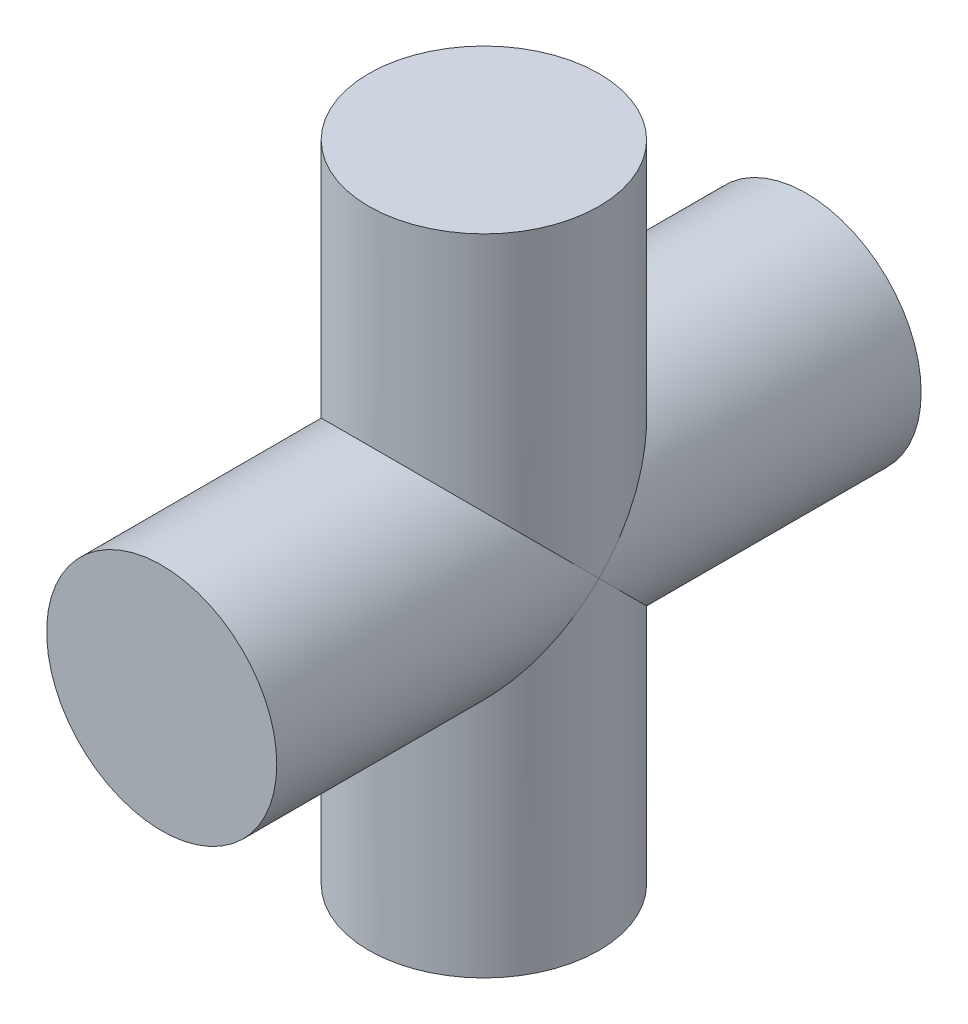
ISO-10303-21;
HEADER;
FILE_DESCRIPTION(('STEP AP214'),'2;1');
FILE_NAME('part.step','',(''),(''),'','','');
FILE_SCHEMA(('AUTOMOTIVE_DESIGN { 1 0 10303 214 1 1 1 1 }'));
ENDSEC;
DATA;
#1=APPLICATION_CONTEXT('core data for automotive mechanical design processes');
#2=APPLICATION_PROTOCOL_DEFINITION('international standard','automotive_design',2000,#1);
#3=PRODUCT_CONTEXT('',#1,'mechanical');
#4=PRODUCT('Part','Part','',(#3));
#5=PRODUCT_RELATED_PRODUCT_CATEGORY('part','',(#4));
#6=PRODUCT_DEFINITION_FORMATION('','',#4);
#7=PRODUCT_DEFINITION_CONTEXT('part definition',#1,'design');
#8=PRODUCT_DEFINITION('design','',#6,#7);
#9=PRODUCT_DEFINITION_SHAPE('','',#8);
#10=(LENGTH_UNIT() NAMED_UNIT(*) SI_UNIT(.MILLI.,.METRE.));
#11=(NAMED_UNIT(*) PLANE_ANGLE_UNIT() SI_UNIT($,.RADIAN.));
#12=(NAMED_UNIT(*) SI_UNIT($,.STERADIAN.) SOLID_ANGLE_UNIT());
#13=UNCERTAINTY_MEASURE_WITH_UNIT(LENGTH_MEASURE(1.E-05),#10,'distance_accuracy_value','');
#14=(GEOMETRIC_REPRESENTATION_CONTEXT(3) GLOBAL_UNCERTAINTY_ASSIGNED_CONTEXT((#13)) GLOBAL_UNIT_ASSIGNED_CONTEXT((#10,
#11,#12)) REPRESENTATION_CONTEXT('',''));
#15=CARTESIAN_POINT('',(0.,0.,0.));
#16=DIRECTION('',(0.,0.,1.));
#17=DIRECTION('',(1.,0.,0.));
#18=AXIS2_PLACEMENT_3D('',#15,#16,#17);
#19=CARTESIAN_POINT('',(0.,0.,21.));
#20=DIRECTION('',(0.,0.,-1.));
#21=DIRECTION('',(-1.,0.,0.));
#22=AXIS2_PLACEMENT_3D('',#19,#20,#21);
#23=CYLINDRICAL_SURFACE('',#22,7.5);
#24=CARTESIAN_POINT('',(0.,0.,21.));
#25=DIRECTION('',(0.,0.,1.));
#26=DIRECTION('',(1.,0.,0.));
#27=AXIS2_PLACEMENT_3D('',#24,#25,#26);
#28=CIRCLE('',#27,7.5);
#29=CARTESIAN_POINT('',(7.5,0.,21.));
#30=VERTEX_POINT('',#29);
#31=EDGE_CURVE('E66',#30,#30,#28,.T.);
#32=ORIENTED_EDGE('',*,*,#31,.F.);
#33=EDGE_LOOP('',(#32));
#34=FACE_BOUND('',#33,.T.);
#35=CARTESIAN_POINT('',(0.,0.,0.));
#36=DIRECTION('',(0.,-0.707106781186547,-0.707106781186547));
#37=DIRECTION('',(0.,0.707106781186547,-0.707106781186547));
#38=AXIS2_PLACEMENT_3D('',#35,#36,#37);
#39=ELLIPSE('',#38,10.6066017177982,7.5);
#40=CARTESIAN_POINT('',(7.5,0.,0.));
#41=VERTEX_POINT('',#40);
#42=CARTESIAN_POINT('',(-7.5,0.,0.));
#43=VERTEX_POINT('',#42);
#44=EDGE_CURVE('E48',#41,#43,#39,.T.);
#45=ORIENTED_EDGE('',*,*,#44,.F.);
#46=CARTESIAN_POINT('',(0.,0.,0.));
#47=DIRECTION('',(0.,0.707106781186547,-0.707106781186547));
#48=DIRECTION('',(0.,-0.707106781186547,-0.707106781186547));
#49=AXIS2_PLACEMENT_3D('',#46,#47,#48);
#50=ELLIPSE('',#49,10.6066017177982,7.5);
#51=EDGE_CURVE('E60',#43,#41,#50,.T.);
#52=ORIENTED_EDGE('',*,*,#51,.F.);
#53=EDGE_LOOP('',(#45,#52));
#54=FACE_BOUND('',#53,.T.);
#55=ADVANCED_FACE('F39',(#34,#54),#23,.T.);
#56=CARTESIAN_POINT('',(0.,0.,21.));
#57=DIRECTION('',(0.,0.,1.));
#58=DIRECTION('',(1.,0.,0.));
#59=AXIS2_PLACEMENT_3D('',#56,#57,#58);
#60=PLANE('',#59);
#61=ORIENTED_EDGE('',*,*,#31,.T.);
#62=EDGE_LOOP('',(#61));
#63=FACE_BOUND('',#62,.T.);
#64=ADVANCED_FACE('F89',(#63),#60,.T.);
#65=CARTESIAN_POINT('',(0.,-21.,0.));
#66=DIRECTION('',(0.,1.,0.));
#67=DIRECTION('',(0.,0.,1.));
#68=AXIS2_PLACEMENT_3D('',#65,#66,#67);
#69=PLANE('',#68);
#70=CARTESIAN_POINT('',(0.,-21.,0.));
#71=DIRECTION('',(0.,1.,0.));
#72=DIRECTION('',(0.,0.,1.));
#73=AXIS2_PLACEMENT_3D('',#70,#71,#72);
#74=CIRCLE('',#73,7.5);
#75=CARTESIAN_POINT('',(0.,-21.,7.5));
#76=VERTEX_POINT('',#75);
#77=EDGE_CURVE('E108',#76,#76,#74,.T.);
#78=ORIENTED_EDGE('',*,*,#77,.F.);
#79=EDGE_LOOP('',(#78));
#80=FACE_BOUND('',#79,.T.);
#81=ADVANCED_FACE('F86',(#80),#69,.F.);
#82=CARTESIAN_POINT('',(0.,21.,0.));
#83=DIRECTION('',(0.,-1.,0.));
#84=DIRECTION('',(0.,0.,-1.));
#85=AXIS2_PLACEMENT_3D('',#82,#83,#84);
#86=CYLINDRICAL_SURFACE('',#85,7.5);
#87=ORIENTED_EDGE('',*,*,#77,.T.);
#88=EDGE_LOOP('',(#87));
#89=FACE_BOUND('',#88,.T.);
#90=CARTESIAN_POINT('',(0.,0.,0.));
#91=DIRECTION('',(0.,0.707106781186547,-0.707106781186547));
#92=DIRECTION('',(0.,-0.707106781186547,-0.707106781186547));
#93=AXIS2_PLACEMENT_3D('',#90,#91,#92);
#94=ELLIPSE('',#93,10.6066017177982,7.5);
#95=EDGE_CURVE('E54',#43,#41,#94,.F.);
#96=ORIENTED_EDGE('',*,*,#95,.T.);
#97=ORIENTED_EDGE('',*,*,#44,.T.);
#98=EDGE_LOOP('',(#96,#97));
#99=FACE_BOUND('',#98,.T.);
#100=ADVANCED_FACE('F68',(#89,#99),#86,.T.);
#101=CARTESIAN_POINT('',(0.,0.,-21.));
#102=DIRECTION('',(0.,0.,1.));
#103=DIRECTION('',(1.,0.,0.));
#104=AXIS2_PLACEMENT_3D('',#101,#102,#103);
#105=PLANE('',#104);
#106=CARTESIAN_POINT('',(0.,0.,-21.));
#107=DIRECTION('',(0.,0.,1.));
#108=DIRECTION('',(1.,0.,0.));
#109=AXIS2_PLACEMENT_3D('',#106,#107,#108);
#110=CIRCLE('',#109,7.5);
#111=CARTESIAN_POINT('',(7.5,0.,-21.));
#112=VERTEX_POINT('',#111);
#113=EDGE_CURVE('E98',#112,#112,#110,.T.);
#114=ORIENTED_EDGE('',*,*,#113,.F.);
#115=EDGE_LOOP('',(#114));
#116=FACE_BOUND('',#115,.T.);
#117=ADVANCED_FACE('F81',(#116),#105,.F.);
#118=ORIENTED_EDGE('',*,*,#113,.T.);
#119=EDGE_LOOP('',(#118));
#120=FACE_BOUND('',#119,.T.);
#121=CARTESIAN_POINT('',(0.,0.,0.));
#122=DIRECTION('',(0.,-0.707106781186547,-0.707106781186547));
#123=DIRECTION('',(0.,0.707106781186547,-0.707106781186547));
#124=AXIS2_PLACEMENT_3D('',#121,#122,#123);
#125=ELLIPSE('',#124,10.6066017177982,7.5);
#126=EDGE_CURVE('E11',#41,#43,#125,.F.);
#127=ORIENTED_EDGE('',*,*,#126,.F.);
#128=ORIENTED_EDGE('',*,*,#95,.F.);
#129=EDGE_LOOP('',(#127,#128));
#130=FACE_BOUND('',#129,.T.);
#131=ADVANCED_FACE('F41',(#120,#130),#23,.T.);
#132=CARTESIAN_POINT('',(0.,21.,0.));
#133=DIRECTION('',(0.,1.,0.));
#134=DIRECTION('',(0.,0.,1.));
#135=AXIS2_PLACEMENT_3D('',#132,#133,#134);
#136=CIRCLE('',#135,7.5);
#137=CARTESIAN_POINT('',(0.,21.,7.5));
#138=VERTEX_POINT('',#137);
#139=EDGE_CURVE('E102',#138,#138,#136,.T.);
#140=ORIENTED_EDGE('',*,*,#139,.F.);
#141=EDGE_LOOP('',(#140));
#142=FACE_BOUND('',#141,.T.);
#143=ORIENTED_EDGE('',*,*,#51,.T.);
#144=ORIENTED_EDGE('',*,*,#126,.T.);
#145=EDGE_LOOP('',(#143,#144));
#146=FACE_BOUND('',#145,.T.);
#147=ADVANCED_FACE('F70',(#142,#146),#86,.T.);
#148=CARTESIAN_POINT('',(0.,21.,0.));
#149=DIRECTION('',(0.,1.,0.));
#150=DIRECTION('',(0.,0.,1.));
#151=AXIS2_PLACEMENT_3D('',#148,#149,#150);
#152=PLANE('',#151);
#153=ORIENTED_EDGE('',*,*,#139,.T.);
#154=EDGE_LOOP('',(#153));
#155=FACE_BOUND('',#154,.T.);
#156=ADVANCED_FACE('F72',(#155),#152,.T.);
#157=CLOSED_SHELL('',(#55,#64,#81,#100,#117,#131,#147,#156));
#158=MANIFOLD_SOLID_BREP('B2',#157);
#159=ADVANCED_BREP_SHAPE_REPRESENTATION('',(#18,#158),#14);
#160=SHAPE_DEFINITION_REPRESENTATION(#9,#159);
ENDSEC;
END-ISO-10303-21;
